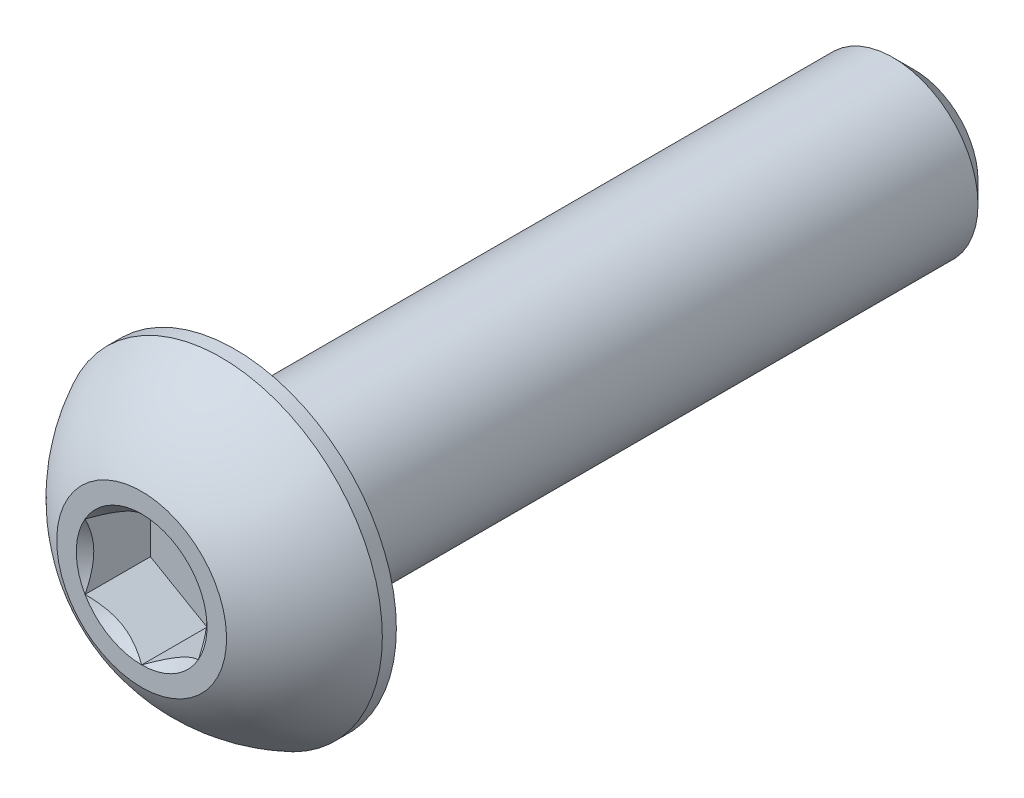
ISO-10303-21;
HEADER;
FILE_DESCRIPTION(('STEP AP214'),'2;1');
FILE_NAME('part.step','',(''),(''),'','','');
FILE_SCHEMA(('AUTOMOTIVE_DESIGN { 1 0 10303 214 1 1 1 1 }'));
ENDSEC;
DATA;
#1=APPLICATION_CONTEXT('core data for automotive mechanical design processes');
#2=APPLICATION_PROTOCOL_DEFINITION('international standard','automotive_design',2000,#1);
#3=PRODUCT_CONTEXT('',#1,'mechanical');
#4=PRODUCT('Part','Part','',(#3));
#5=PRODUCT_RELATED_PRODUCT_CATEGORY('part','',(#4));
#6=PRODUCT_DEFINITION_FORMATION('','',#4);
#7=PRODUCT_DEFINITION_CONTEXT('part definition',#1,'design');
#8=PRODUCT_DEFINITION('design','',#6,#7);
#9=PRODUCT_DEFINITION_SHAPE('','',#8);
#10=(LENGTH_UNIT() NAMED_UNIT(*) SI_UNIT(.MILLI.,.METRE.));
#11=(NAMED_UNIT(*) PLANE_ANGLE_UNIT() SI_UNIT($,.RADIAN.));
#12=(NAMED_UNIT(*) SI_UNIT($,.STERADIAN.) SOLID_ANGLE_UNIT());
#13=UNCERTAINTY_MEASURE_WITH_UNIT(LENGTH_MEASURE(1.E-05),#10,'distance_accuracy_value','');
#14=(GEOMETRIC_REPRESENTATION_CONTEXT(3) GLOBAL_UNCERTAINTY_ASSIGNED_CONTEXT((#13)) GLOBAL_UNIT_ASSIGNED_CONTEXT((#10,
#11,#12)) REPRESENTATION_CONTEXT('',''));
#15=CARTESIAN_POINT('',(0.,0.,0.));
#16=DIRECTION('',(0.,0.,1.));
#17=DIRECTION('',(1.,0.,0.));
#18=AXIS2_PLACEMENT_3D('',#15,#16,#17);
#19=CARTESIAN_POINT('',(0.,0.,-13.65));
#20=DIRECTION('',(0.,0.,1.));
#21=DIRECTION('',(1.,0.,0.));
#22=AXIS2_PLACEMENT_3D('',#19,#20,#21);
#23=PLANE('',#22);
#24=CARTESIAN_POINT('',(0.,0.,-13.65));
#25=DIRECTION('',(0.,0.,1.));
#26=DIRECTION('',(1.,0.,0.));
#27=AXIS2_PLACEMENT_3D('',#24,#25,#26);
#28=CIRCLE('',#27,1.12500000000003);
#29=CARTESIAN_POINT('',(1.12500000000003,0.,-13.65));
#30=VERTEX_POINT('',#29);
#31=EDGE_CURVE('E44',#30,#30,#28,.T.);
#32=ORIENTED_EDGE('',*,*,#31,.F.);
#33=EDGE_LOOP('',(#32));
#34=FACE_BOUND('',#33,.T.);
#35=ADVANCED_FACE('F41',(#34),#23,.F.);
#36=CARTESIAN_POINT('',(0.,0.,-13.65));
#37=DIRECTION('',(0.,0.,1.));
#38=DIRECTION('',(1.,0.,0.));
#39=AXIS2_PLACEMENT_3D('',#36,#37,#38);
#40=CONICAL_SURFACE('',#39,1.12500000000003,0.785398163397431);
#41=CARTESIAN_POINT('',(0.,0.,-13.275));
#42=DIRECTION('',(0.,0.,1.));
#43=DIRECTION('',(1.,0.,0.));
#44=AXIS2_PLACEMENT_3D('',#41,#42,#43);
#45=CIRCLE('',#44,1.50000000000002);
#46=CARTESIAN_POINT('',(1.50000000000002,0.,-13.275));
#47=VERTEX_POINT('',#46);
#48=EDGE_CURVE('E138',#47,#47,#45,.T.);
#49=ORIENTED_EDGE('',*,*,#48,.F.);
#50=EDGE_LOOP('',(#49));
#51=FACE_BOUND('',#50,.T.);
#52=ORIENTED_EDGE('',*,*,#31,.T.);
#53=EDGE_LOOP('',(#52));
#54=FACE_BOUND('',#53,.T.);
#55=ADVANCED_FACE('F161',(#51,#54),#40,.T.);
#56=CARTESIAN_POINT('',(0.,0.,0.));
#57=DIRECTION('',(0.,0.,1.));
#58=DIRECTION('',(1.,0.,0.));
#59=AXIS2_PLACEMENT_3D('',#56,#57,#58);
#60=CYLINDRICAL_SURFACE('',#59,1.50000000000002);
#61=CARTESIAN_POINT('',(0.,0.,-1.65000000000001));
#62=DIRECTION('',(0.,0.,1.));
#63=DIRECTION('',(1.,0.,0.));
#64=AXIS2_PLACEMENT_3D('',#61,#62,#63);
#65=CIRCLE('',#64,1.50000000000002);
#66=CARTESIAN_POINT('',(1.50000000000002,0.,-1.65000000000001));
#67=VERTEX_POINT('',#66);
#68=EDGE_CURVE('E12',#67,#67,#65,.T.);
#69=ORIENTED_EDGE('',*,*,#68,.F.);
#70=EDGE_LOOP('',(#69));
#71=FACE_BOUND('',#70,.T.);
#72=ORIENTED_EDGE('',*,*,#48,.T.);
#73=EDGE_LOOP('',(#72));
#74=FACE_BOUND('',#73,.T.);
#75=ADVANCED_FACE('F168',(#71,#74),#60,.T.);
#76=CARTESIAN_POINT('',(2.85000000000002,0.,-1.65000000000001));
#77=DIRECTION('',(0.,0.,-1.));
#78=DIRECTION('',(-1.,0.,0.));
#79=AXIS2_PLACEMENT_3D('',#76,#77,#78);
#80=PLANE('',#79);
#81=ORIENTED_EDGE('',*,*,#68,.T.);
#82=EDGE_LOOP('',(#81));
#83=FACE_BOUND('',#82,.T.);
#84=CARTESIAN_POINT('',(0.,0.,-1.65000000000001));
#85=DIRECTION('',(0.,0.,1.));
#86=DIRECTION('',(1.,0.,0.));
#87=AXIS2_PLACEMENT_3D('',#84,#85,#86);
#88=CIRCLE('',#87,2.85);
#89=CARTESIAN_POINT('',(2.85,0.,-1.65000000000001));
#90=VERTEX_POINT('',#89);
#91=EDGE_CURVE('E262',#90,#90,#88,.T.);
#92=ORIENTED_EDGE('',*,*,#91,.F.);
#93=EDGE_LOOP('',(#92));
#94=FACE_BOUND('',#93,.T.);
#95=ADVANCED_FACE('F171',(#83,#94),#80,.T.);
#96=CARTESIAN_POINT('',(1.,-0.577350269189592,-1.1550000000001));
#97=DIRECTION('',(0.,0.,1.));
#98=DIRECTION('',(1.,0.,0.));
#99=AXIS2_PLACEMENT_3D('',#96,#97,#98);
#100=PLANE('',#99);
#101=DIRECTION('',(0.866025403784438,0.5,0.));
#102=VECTOR('',#101,1.);
#103=CARTESIAN_POINT('',(0.,-1.15470053837929,-1.15499999999999));
#104=LINE('',#103,#102);
#105=CARTESIAN_POINT('',(0.,-1.15470053837929,-1.15499999999999));
#106=VERTEX_POINT('',#105);
#107=CARTESIAN_POINT('',(1.,-0.577350269189592,-1.1550000000001));
#108=VERTEX_POINT('',#107);
#109=EDGE_CURVE('E112',#106,#108,#104,.T.);
#110=ORIENTED_EDGE('',*,*,#109,.T.);
#111=DIRECTION('',(0.,1.,0.));
#112=VECTOR('',#111,1.);
#113=CARTESIAN_POINT('',(1.,-0.577350269189592,-1.1550000000001));
#114=LINE('',#113,#112);
#115=CARTESIAN_POINT('',(1.,0.577350269189592,-1.1550000000001));
#116=VERTEX_POINT('',#115);
#117=EDGE_CURVE('E299',#108,#116,#114,.T.);
#118=ORIENTED_EDGE('',*,*,#117,.T.);
#119=DIRECTION('',(-0.866025403784439,0.499999999999999,0.));
#120=VECTOR('',#119,1.);
#121=CARTESIAN_POINT('',(1.,0.577350269189592,-1.1550000000001));
#122=LINE('',#121,#120);
#123=CARTESIAN_POINT('',(0.,1.15470053837929,-1.15499999999999));
#124=VERTEX_POINT('',#123);
#125=EDGE_CURVE('E295',#116,#124,#122,.T.);
#126=ORIENTED_EDGE('',*,*,#125,.T.);
#127=DIRECTION('',(-0.866025403784439,-0.5,0.));
#128=VECTOR('',#127,1.);
#129=CARTESIAN_POINT('',(0.,1.15470053837929,-1.15499999999999));
#130=LINE('',#129,#128);
#131=CARTESIAN_POINT('',(-1.,0.577350269189592,-1.15500000000013));
#132=VERTEX_POINT('',#131);
#133=EDGE_CURVE('E291',#124,#132,#130,.T.);
#134=ORIENTED_EDGE('',*,*,#133,.T.);
#135=DIRECTION('',(0.,-1.,0.));
#136=VECTOR('',#135,1.);
#137=CARTESIAN_POINT('',(-1.,0.577350269189592,-1.15500000000013));
#138=LINE('',#137,#136);
#139=CARTESIAN_POINT('',(-1.,-0.577350269189592,-1.15500000000013));
#140=VERTEX_POINT('',#139);
#141=EDGE_CURVE('E287',#132,#140,#138,.T.);
#142=ORIENTED_EDGE('',*,*,#141,.T.);
#143=DIRECTION('',(0.866025403784439,-0.5,0.));
#144=VECTOR('',#143,1.);
#145=CARTESIAN_POINT('',(-1.,-0.577350269189592,-1.15500000000013));
#146=LINE('',#145,#144);
#147=EDGE_CURVE('E271',#140,#106,#146,.T.);
#148=ORIENTED_EDGE('',*,*,#147,.T.);
#149=EDGE_LOOP('',(#110,#118,#126,#134,#142,#148));
#150=FACE_BOUND('',#149,.T.);
#151=ADVANCED_FACE('F164',(#150),#100,.T.);
#152=CARTESIAN_POINT('',(-1.,-0.577350269189592,-1.15500000000013));
#153=DIRECTION('',(-0.5,-0.866025403784439,0.));
#154=DIRECTION('',(0.866025403784439,-0.5,0.));
#155=AXIS2_PLACEMENT_3D('',#152,#153,#154);
#156=PLANE('',#155);
#157=DIRECTION('',(0.,0.,1.));
#158=VECTOR('',#157,1.);
#159=CARTESIAN_POINT('',(-1.,-0.577350269189592,-1.15500000000013));
#160=LINE('',#159,#158);
#161=CARTESIAN_POINT('',(-1.,-0.577350269189592,-1.11022302462516E-13));
#162=VERTEX_POINT('',#161);
#163=EDGE_CURVE('E119',#140,#162,#160,.T.);
#164=ORIENTED_EDGE('',*,*,#163,.T.);
#165=CARTESIAN_POINT('',(-1.00020000000001,-0.57723479913574,0.000115487372498446));
#166=CARTESIAN_POINT('',(-0.965817404992807,-0.597085599618594,-0.0197220691743291));
#167=CARTESIAN_POINT('',(-0.930859881860152,-0.617268335009436,-0.0383949793611503));
#168=CARTESIAN_POINT('',(-0.859577197043879,-0.65842341227667,-0.0725852572768633));
#169=CARTESIAN_POINT('',(-0.823245249470986,-0.679399671988061,-0.0880835909765679));
#170=CARTESIAN_POINT('',(-0.749983386196663,-0.72169742847083,-0.114632692857768));
#171=CARTESIAN_POINT('',(-0.713072148554564,-0.743008141459626,-0.12575022600311));
#172=CARTESIAN_POINT('',(-0.638437270689108,-0.786098608286161,-0.142880134223841));
#173=CARTESIAN_POINT('',(-0.600715911891317,-0.807877044942236,-0.148905302533336));
#174=CARTESIAN_POINT('',(-0.535707801582028,-0.845409494928823,-0.154339445032517));
#175=CARTESIAN_POINT('',(-0.508505628471805,-0.861114676896574,-0.155143061683289));
#176=CARTESIAN_POINT('',(-0.454153959330884,-0.892494627706005,-0.153793300583146));
#177=CARTESIAN_POINT('',(-0.427004476245124,-0.908169389073921,-0.151639270452835));
#178=CARTESIAN_POINT('',(-0.345943722673061,-0.954969836969461,-0.140883027871549));
#179=CARTESIAN_POINT('',(-0.292435859021621,-0.985862616452396,-0.127985443584627));
#180=CARTESIAN_POINT('',(-0.198523934856619,-1.04008269114918,-0.0968592693978172));
#181=CARTESIAN_POINT('',(-0.157679476328197,-1.06366425027546,-0.0802622022981839));
#182=CARTESIAN_POINT('',(-0.0775903626180563,-1.10990372163515,-0.0428750753147612));
#183=CARTESIAN_POINT('',(-0.0383409891295505,-1.13256435798426,-0.0220986581826527));
#184=CARTESIAN_POINT('',(0.000200000000005751,-1.15481600843304,0.000115487372609469));
#185=B_SPLINE_CURVE_WITH_KNOTS('',3,(#165,#166,#167,#168,#169,#170,#171,#172,#173,#174,#175,
#176,#177,#178,#179,#180,#181,#182,#183,#184),.UNSPECIFIED.,.F.,.F.,(4,2,2,2,2,2,2,2,2,4),(0.,
0.133237676828565,0.267252229834496,0.399137076269304,0.530689603280776,0.624814864263833,
0.718960890149095,0.907306626112015,1.05710100361784,1.20641411519283),.UNSPECIFIED.);
#186=CARTESIAN_POINT('',(0.,-1.15470053837929,0.));
#187=VERTEX_POINT('',#186);
#188=EDGE_CURVE('E101',#162,#187,#185,.T.);
#189=ORIENTED_EDGE('',*,*,#188,.T.);
#190=DIRECTION('',(0.,0.,1.));
#191=VECTOR('',#190,1.);
#192=CARTESIAN_POINT('',(0.,-1.15470053837929,-1.15499999999999));
#193=LINE('',#192,#191);
#194=EDGE_CURVE('E118',#106,#187,#193,.T.);
#195=ORIENTED_EDGE('',*,*,#194,.F.);
#196=ORIENTED_EDGE('',*,*,#147,.F.);
#197=EDGE_LOOP('',(#164,#189,#195,#196));
#198=FACE_BOUND('',#197,.T.);
#199=ADVANCED_FACE('F116',(#198),#156,.F.);
#200=CARTESIAN_POINT('',(0.,-1.15470053837929,-1.15499999999999));
#201=DIRECTION('',(0.500000000000001,-0.866025403784438,0.));
#202=DIRECTION('',(0.866025403784438,0.500000000000001,0.));
#203=AXIS2_PLACEMENT_3D('',#200,#201,#202);
#204=PLANE('',#203);
#205=ORIENTED_EDGE('',*,*,#194,.T.);
#206=CARTESIAN_POINT('',(-0.000200000000005751,-1.15481600843304,0.000115487372609469));
#207=CARTESIAN_POINT('',(0.0341825950072014,-1.13496520795025,-0.0197220691742508));
#208=CARTESIAN_POINT('',(0.069140118139854,-1.11478247255944,-0.0383949793610854));
#209=CARTESIAN_POINT('',(0.140422802956123,-1.07362739529223,-0.0725852572768083));
#210=CARTESIAN_POINT('',(0.176754750529013,-1.05265113558083,-0.0880835909765086));
#211=CARTESIAN_POINT('',(0.250016613803337,-1.01035337909805,-0.114632692857699));
#212=CARTESIAN_POINT('',(0.286927851445441,-0.989042666109256,-0.125750226003034));
#213=CARTESIAN_POINT('',(0.361562729310899,-0.945952199282722,-0.142880134223788));
#214=CARTESIAN_POINT('',(0.399284088108686,-0.92417376262665,-0.148905302533313));
#215=CARTESIAN_POINT('',(0.464292198417972,-0.886641312640062,-0.154339445032486));
#216=CARTESIAN_POINT('',(0.491494371528196,-0.870936130672309,-0.155143061683237));
#217=CARTESIAN_POINT('',(0.545846040669121,-0.83955617986288,-0.153793300583066));
#218=CARTESIAN_POINT('',(0.572995523754886,-0.823881418494969,-0.151639270452749));
#219=CARTESIAN_POINT('',(0.654056277326951,-0.777080970599395,-0.140883027871522));
#220=CARTESIAN_POINT('',(0.707564140978383,-0.74618819111637,-0.127985443584748));
#221=CARTESIAN_POINT('',(0.801476065143376,-0.691968116419604,-0.0968592693979216));
#222=CARTESIAN_POINT('',(0.842320523671795,-0.668386557293394,-0.080262202298183));
#223=CARTESIAN_POINT('',(0.922409637381937,-0.622147085933769,-0.0428750753146517));
#224=CARTESIAN_POINT('',(0.961659010870446,-0.599486449584661,-0.0220986581825393));
#225=CARTESIAN_POINT('',(1.00020000000001,-0.57723479913574,0.000115487372526202));
#226=B_SPLINE_CURVE_WITH_KNOTS('',3,(#206,#207,#208,#209,#210,#211,#212,#213,#214,#215,#216,
#217,#218,#219,#220,#221,#222,#223,#224,#225),.UNSPECIFIED.,.F.,.F.,(4,2,2,2,2,2,2,2,2,4),(0.,
0.133237676828535,0.26725222983446,0.399137076269282,0.53068960328075,0.624814864263807,
0.718960890149083,0.907306626112007,1.05710100361782,1.20641411519282),.UNSPECIFIED.);
#227=CARTESIAN_POINT('',(1.,-0.577350269189592,-1.11022302462516E-13));
#228=VERTEX_POINT('',#227);
#229=EDGE_CURVE('E108',#187,#228,#226,.T.);
#230=ORIENTED_EDGE('',*,*,#229,.T.);
#231=DIRECTION('',(0.,0.,1.));
#232=VECTOR('',#231,1.);
#233=CARTESIAN_POINT('',(1.,-0.577350269189592,-1.1550000000001));
#234=LINE('',#233,#232);
#235=EDGE_CURVE('E64',#108,#228,#234,.T.);
#236=ORIENTED_EDGE('',*,*,#235,.F.);
#237=ORIENTED_EDGE('',*,*,#109,.F.);
#238=EDGE_LOOP('',(#205,#230,#236,#237));
#239=FACE_BOUND('',#238,.T.);
#240=ADVANCED_FACE('F123',(#239),#204,.F.);
#241=CARTESIAN_POINT('',(1.,-0.577350269189592,-1.1550000000001));
#242=DIRECTION('',(1.,0.,0.));
#243=DIRECTION('',(0.,1.,0.));
#244=AXIS2_PLACEMENT_3D('',#241,#242,#243);
#245=PLANE('',#244);
#246=ORIENTED_EDGE('',*,*,#235,.T.);
#247=CARTESIAN_POINT('',(1.,-1.1514720864646,0.370385677513768));
#248=CARTESIAN_POINT('',(1.,-1.12343447988548,0.349219919873656));
#249=CARTESIAN_POINT('',(1.,-1.09524064850693,0.328261692175873));
#250=CARTESIAN_POINT('',(1.,-1.03847715644372,0.286846022235605));
#251=CARTESIAN_POINT('',(1.,-1.00990740382972,0.266388706123643));
#252=CARTESIAN_POINT('',(1.,-0.923120894333453,0.205604794954487));
#253=CARTESIAN_POINT('',(1.,-0.864253173759034,0.166192228961369));
#254=CARTESIAN_POINT('',(1.,-0.740809858258006,0.0888206642001995));
#255=CARTESIAN_POINT('',(1.,-0.676100255137754,0.0510730391143684));
#256=CARTESIAN_POINT('',(1.,-0.543448939049115,-0.0179754124487613));
#257=CARTESIAN_POINT('',(1.,-0.475519112027825,-0.0492979721532992));
#258=CARTESIAN_POINT('',(1.,-0.373555850333564,-0.0876182211162822));
#259=CARTESIAN_POINT('',(1.,-0.341031989670926,-0.0986164083578572));
#260=CARTESIAN_POINT('',(1.,-0.275199079052298,-0.118001657852613));
#261=CARTESIAN_POINT('',(1.,-0.241889975173943,-0.126388540223298));
#262=CARTESIAN_POINT('',(1.,-0.175247517043006,-0.139974779280976));
#263=CARTESIAN_POINT('',(1.,-0.141925568218187,-0.145229209231999));
#264=CARTESIAN_POINT('',(1.,-0.0749144362322959,-0.152451313429132));
#265=CARTESIAN_POINT('',(1.,-0.0412251978501849,-0.154418486389602));
#266=CARTESIAN_POINT('',(1.,0.0249580992633844,-0.154916801606947));
#267=CARTESIAN_POINT('',(1.,0.0574512826459954,-0.153569732111393));
#268=CARTESIAN_POINT('',(1.,0.122148505701814,-0.14778351550099));
#269=CARTESIAN_POINT('',(1.,0.154352610132871,-0.143345079338466));
#270=CARTESIAN_POINT('',(1.,0.218799898867578,-0.13154316985481));
#271=CARTESIAN_POINT('',(1.,0.251033743268887,-0.12412945896149));
#272=CARTESIAN_POINT('',(1.,0.314797132354855,-0.106771057501354));
#273=CARTESIAN_POINT('',(1.,0.346326735730949,-0.0968265787112462));
#274=CARTESIAN_POINT('',(1.,0.44559418773016,-0.0617765174458042));
#275=CARTESIAN_POINT('',(1.,0.511919139475962,-0.0326791416433408));
#276=CARTESIAN_POINT('',(1.,0.641453244657445,0.0320153296864961));
#277=CARTESIAN_POINT('',(1.,0.704650133126273,0.0676357767152145));
#278=CARTESIAN_POINT('',(1.,0.825428490174939,0.141123901346897));
#279=CARTESIAN_POINT('',(1.,0.883132947867645,0.178791947135431));
#280=CARTESIAN_POINT('',(1.,0.968148853704525,0.237022852943142));
#281=CARTESIAN_POINT('',(1.,0.99612057038024,0.256638475762837));
#282=CARTESIAN_POINT('',(1.,1.05168177729897,0.296388517061235));
#283=CARTESIAN_POINT('',(1.,1.07927136997697,0.316522792198778));
#284=CARTESIAN_POINT('',(1.,1.10670185346329,0.336872119072879));
#285=B_SPLINE_CURVE_WITH_KNOTS('',3,(#247,#248,#249,#250,#251,#252,#253,#254,#255,#256,#257,
#258,#259,#260,#261,#262,#263,#264,#265,#266,#267,#268,#269,#270,#271,#272,#273,#274,#275,#276,
#277,#278,#279,#280,#281,#282,#283,#284),.UNSPECIFIED.,.F.,.F.,(4,2,2,2,2,2,2,2,2,2,2,2,2,2,2,2,
2,2,4),(0.,0.105386459083268,0.210799187330084,0.423233611565438,0.647793540908474,
0.871580877738546,0.974493074181347,1.07741235827194,1.17846428203197,1.27953161415754,
1.37694086739601,1.47432772585397,1.57343322804282,1.67253043972838,1.88917353996814,
2.10660791038802,2.31323734249835,2.41572589232035,2.51818641476493),.UNSPECIFIED.);
#286=CARTESIAN_POINT('',(1.,0.577350269189592,-1.11022302462516E-13));
#287=VERTEX_POINT('',#286);
#288=EDGE_CURVE('E191',#228,#287,#285,.T.);
#289=ORIENTED_EDGE('',*,*,#288,.T.);
#290=DIRECTION('',(0.,0.,1.));
#291=VECTOR('',#290,1.);
#292=CARTESIAN_POINT('',(1.,0.577350269189592,-1.1550000000001));
#293=LINE('',#292,#291);
#294=EDGE_CURVE('E272',#116,#287,#293,.T.);
#295=ORIENTED_EDGE('',*,*,#294,.F.);
#296=ORIENTED_EDGE('',*,*,#117,.F.);
#297=EDGE_LOOP('',(#246,#289,#295,#296));
#298=FACE_BOUND('',#297,.T.);
#299=ADVANCED_FACE('F236',(#298),#245,.F.);
#300=CARTESIAN_POINT('',(1.,0.577350269189592,-1.1550000000001));
#301=DIRECTION('',(0.499999999999999,0.866025403784439,0.));
#302=DIRECTION('',(-0.866025403784439,0.499999999999999,0.));
#303=AXIS2_PLACEMENT_3D('',#300,#301,#302);
#304=PLANE('',#303);
#305=ORIENTED_EDGE('',*,*,#294,.T.);
#306=CARTESIAN_POINT('',(1.00020000000001,0.57723479913574,0.000115487372526202));
#307=CARTESIAN_POINT('',(0.965817404992812,0.597085599618591,-0.019722069174319));
#308=CARTESIAN_POINT('',(0.930859881860159,0.617268335009432,-0.0383949793611457));
#309=CARTESIAN_POINT('',(0.859577197043887,0.658423412276665,-0.0725852572768608));
#310=CARTESIAN_POINT('',(0.823245249470995,0.679399671988055,-0.0880835909765621));
#311=CARTESIAN_POINT('',(0.749983386196674,0.721697428470824,-0.114632692857767));
#312=CARTESIAN_POINT('',(0.713072148554574,0.74300814145962,-0.125750226003116));
#313=CARTESIAN_POINT('',(0.638437270689114,0.786098608286157,-0.142880134223832));
#314=CARTESIAN_POINT('',(0.600715911891319,0.807877044942235,-0.148905302533303));
#315=CARTESIAN_POINT('',(0.535707801582027,0.845409494928823,-0.154339445032493));
#316=CARTESIAN_POINT('',(0.508505628471804,0.861114676896574,-0.155143061683283));
#317=CARTESIAN_POINT('',(0.454153959330883,0.892494627706005,-0.153793300583153));
#318=CARTESIAN_POINT('',(0.427004476245123,0.908169389073922,-0.151639270452838));
#319=CARTESIAN_POINT('',(0.34594372267306,0.954969836969462,-0.140883027871544));
#320=CARTESIAN_POINT('',(0.292435859021621,0.985862616452396,-0.127985443584626));
#321=CARTESIAN_POINT('',(0.198523934856619,1.04008269114918,-0.0968592693978183));
#322=CARTESIAN_POINT('',(0.157679476328197,1.06366425027546,-0.080262202298185));
#323=CARTESIAN_POINT('',(0.0775903626180565,1.10990372163515,-0.0428750753147615));
#324=CARTESIAN_POINT('',(0.0383409891295504,1.13256435798426,-0.0220986581826523));
#325=CARTESIAN_POINT('',(-0.000200000000005751,1.15481600843304,0.000115487372609469));
#326=B_SPLINE_CURVE_WITH_KNOTS('',3,(#306,#307,#308,#309,#310,#311,#312,#313,#314,#315,#316,
#317,#318,#319,#320,#321,#322,#323,#324,#325),.UNSPECIFIED.,.F.,.F.,(4,2,2,2,2,2,2,2,2,4),(0.,
0.133237676828569,0.267252229834494,0.399137076269305,0.530689603280784,0.624814864263843,
0.718960890149105,0.907306626112023,1.05710100361785,1.20641411519284),.UNSPECIFIED.);
#327=CARTESIAN_POINT('',(0.,1.15470053837929,0.));
#328=VERTEX_POINT('',#327);
#329=EDGE_CURVE('E143',#287,#328,#326,.T.);
#330=ORIENTED_EDGE('',*,*,#329,.T.);
#331=DIRECTION('',(0.,0.,1.));
#332=VECTOR('',#331,1.);
#333=CARTESIAN_POINT('',(0.,1.15470053837929,-1.15499999999999));
#334=LINE('',#333,#332);
#335=EDGE_CURVE('E276',#124,#328,#334,.T.);
#336=ORIENTED_EDGE('',*,*,#335,.F.);
#337=ORIENTED_EDGE('',*,*,#125,.F.);
#338=EDGE_LOOP('',(#305,#330,#336,#337));
#339=FACE_BOUND('',#338,.T.);
#340=ADVANCED_FACE('F232',(#339),#304,.F.);
#341=CARTESIAN_POINT('',(0.,1.15470053837929,-1.15499999999999));
#342=DIRECTION('',(-0.5,0.866025403784439,0.));
#343=DIRECTION('',(-0.866025403784439,-0.5,0.));
#344=AXIS2_PLACEMENT_3D('',#341,#342,#343);
#345=PLANE('',#344);
#346=ORIENTED_EDGE('',*,*,#335,.T.);
#347=CARTESIAN_POINT('',(0.000200000000005751,1.15481600843304,0.000115487372609469));
#348=CARTESIAN_POINT('',(-0.0341825950071968,1.13496520795026,-0.0197220691742432));
#349=CARTESIAN_POINT('',(-0.0691401181398401,1.11478247255945,-0.0383949793610755));
#350=CARTESIAN_POINT('',(-0.140422802956093,1.07362739529224,-0.072585257276797));
#351=CARTESIAN_POINT('',(-0.176754750528977,1.05265113558084,-0.088083590976498));
#352=CARTESIAN_POINT('',(-0.250016613803295,1.01035337909808,-0.114632692857681));
#353=CARTESIAN_POINT('',(-0.286927851445401,0.989042666109299,-0.125750226003009));
#354=CARTESIAN_POINT('',(-0.361562729310825,0.945952199282745,-0.142880134223787));
#355=CARTESIAN_POINT('',(-0.399284088108578,0.924173762626637,-0.148905302533343));
#356=CARTESIAN_POINT('',(-0.46429219841787,0.886641312640065,-0.154339445032513));
#357=CARTESIAN_POINT('',(-0.491494371528118,0.870936130672339,-0.155143061683245));
#358=CARTESIAN_POINT('',(-0.54584604066907,0.839556179862926,-0.153793300583061));
#359=CARTESIAN_POINT('',(-0.572995523754837,0.823881418495003,-0.151639270452748));
#360=CARTESIAN_POINT('',(-0.654056277326917,0.777080970599405,-0.14088302787154));
#361=CARTESIAN_POINT('',(-0.707564140978371,0.746188191116377,-0.127985443584781));
#362=CARTESIAN_POINT('',(-0.801476065143368,0.691968116419608,-0.0968592693979505));
#363=CARTESIAN_POINT('',(-0.842320523671772,0.668386557293398,-0.0802622022982016));
#364=CARTESIAN_POINT('',(-0.922409637381903,0.622147085933799,-0.0428750753146596));
#365=CARTESIAN_POINT('',(-0.961659010870417,0.599486449584716,-0.0220986581825467));
#366=CARTESIAN_POINT('',(-1.00020000000001,0.577234799135851,0.000115487372498446));
#367=B_SPLINE_CURVE_WITH_KNOTS('',3,(#347,#348,#349,#350,#351,#352,#353,#354,#355,#356,#357,
#358,#359,#360,#361,#362,#363,#364,#365,#366),.UNSPECIFIED.,.F.,.F.,(4,2,2,2,2,2,2,2,2,4),(0.,
0.133237676828506,0.267252229834414,0.399137076269216,0.530689603280658,0.624814864263735,
0.718960890149035,0.907306626112005,1.05710100361779,1.20641411519276),.UNSPECIFIED.);
#368=CARTESIAN_POINT('',(-1.,0.577350269189592,-1.11022302462516E-13));
#369=VERTEX_POINT('',#368);
#370=EDGE_CURVE('E201',#328,#369,#367,.T.);
#371=ORIENTED_EDGE('',*,*,#370,.T.);
#372=DIRECTION('',(0.,0.,1.));
#373=VECTOR('',#372,1.);
#374=CARTESIAN_POINT('',(-1.,0.577350269189592,-1.15500000000013));
#375=LINE('',#374,#373);
#376=EDGE_CURVE('E280',#132,#369,#375,.T.);
#377=ORIENTED_EDGE('',*,*,#376,.F.);
#378=ORIENTED_EDGE('',*,*,#133,.F.);
#379=EDGE_LOOP('',(#346,#371,#377,#378));
#380=FACE_BOUND('',#379,.T.);
#381=ADVANCED_FACE('F228',(#380),#345,.F.);
#382=CARTESIAN_POINT('',(-1.,0.577350269189592,-1.15500000000013));
#383=DIRECTION('',(-1.,0.,0.));
#384=DIRECTION('',(0.,-1.,0.));
#385=AXIS2_PLACEMENT_3D('',#382,#383,#384);
#386=PLANE('',#385);
#387=ORIENTED_EDGE('',*,*,#376,.T.);
#388=CARTESIAN_POINT('',(-1.,-1.1514720864646,0.37038567751374));
#389=CARTESIAN_POINT('',(-1.,-1.12343447988547,0.349219919873639));
#390=CARTESIAN_POINT('',(-1.,-1.09524064850692,0.32826169217586));
#391=CARTESIAN_POINT('',(-1.,-1.0384771564437,0.286846022235594));
#392=CARTESIAN_POINT('',(-1.,-1.0099074038297,0.26638870612363));
#393=CARTESIAN_POINT('',(-1.,-0.923120894333429,0.205604794954468));
#394=CARTESIAN_POINT('',(-1.,-0.864253173759005,0.166192228961346));
#395=CARTESIAN_POINT('',(-1.,-0.740809858257972,0.0888206642001826));
#396=CARTESIAN_POINT('',(-1.,-0.676100255137721,0.0510730391143613));
#397=CARTESIAN_POINT('',(-1.,-0.543448939049097,-0.0179754124487811));
#398=CARTESIAN_POINT('',(-1.,-0.475519112027823,-0.0492979721533416));
#399=CARTESIAN_POINT('',(-1.,-0.373555850333564,-0.0876182211163035));
#400=CARTESIAN_POINT('',(-1.,-0.341031989670922,-0.0986164083578642));
#401=CARTESIAN_POINT('',(-1.,-0.275199079052295,-0.118001657852609));
#402=CARTESIAN_POINT('',(-1.,-0.241889975173941,-0.126388540223297));
#403=CARTESIAN_POINT('',(-1.,-0.175247517043007,-0.139974779280978));
#404=CARTESIAN_POINT('',(-1.,-0.141925568218188,-0.145229209231999));
#405=CARTESIAN_POINT('',(-1.,-0.0749144362322964,-0.152451313429132));
#406=CARTESIAN_POINT('',(-1.,-0.0412251978501851,-0.154418486389602));
#407=CARTESIAN_POINT('',(-1.,0.0249580992633935,-0.154916801606947));
#408=CARTESIAN_POINT('',(-1.,0.0574512826460136,-0.153569732111392));
#409=CARTESIAN_POINT('',(-1.,0.12214850570185,-0.147783515500987));
#410=CARTESIAN_POINT('',(-1.,0.154352610132917,-0.143345079338463));
#411=CARTESIAN_POINT('',(-1.,0.218799898867637,-0.131543169854795));
#412=CARTESIAN_POINT('',(-1.,0.25103374326895,-0.124129458961462));
#413=CARTESIAN_POINT('',(-1.,0.31479713235494,-0.106771057501343));
#414=CARTESIAN_POINT('',(-1.,0.34632673573105,-0.0968265787112645));
#415=CARTESIAN_POINT('',(-1.,0.445594187730263,-0.0617765174458633));
#416=CARTESIAN_POINT('',(-1.,0.511919139476024,-0.0326791416433398));
#417=CARTESIAN_POINT('',(-1.,0.641453244657461,0.0320153296865338));
#418=CARTESIAN_POINT('',(-1.,0.704650133126285,0.067635776715229));
#419=CARTESIAN_POINT('',(-1.,0.825428490174944,0.141123901346893));
#420=CARTESIAN_POINT('',(-1.,0.883132947867649,0.178791947135431));
#421=CARTESIAN_POINT('',(-1.,0.968148853704525,0.237022852943144));
#422=CARTESIAN_POINT('',(-1.,0.996120570380237,0.256638475762838));
#423=CARTESIAN_POINT('',(-1.,1.05168177729897,0.296388517061228));
#424=CARTESIAN_POINT('',(-1.,1.07927136997697,0.316522792198763));
#425=CARTESIAN_POINT('',(-1.,1.10670185346329,0.336872119072851));
#426=B_SPLINE_CURVE_WITH_KNOTS('',3,(#388,#389,#390,#391,#392,#393,#394,#395,#396,#397,#398,
#399,#400,#401,#402,#403,#404,#405,#406,#407,#408,#409,#410,#411,#412,#413,#414,#415,#416,#417,
#418,#419,#420,#421,#422,#423,#424,#425),.UNSPECIFIED.,.F.,.F.,(4,2,2,2,2,2,2,2,2,2,2,2,2,2,2,2,
2,2,4),(0.,0.105386459083272,0.210799187330092,0.423233611565463,0.647793540908487,
0.871580877738541,0.974493074181337,1.07741235827193,1.17846428203196,1.27953161415753,
1.37694086739602,1.47432772585401,1.57343322804288,1.67253043972847,1.88917353996817,
2.10660791038802,2.31323734249834,2.41572589232034,2.51818641476491),.UNSPECIFIED.);
#427=EDGE_CURVE('E121',#369,#162,#426,.F.);
#428=ORIENTED_EDGE('',*,*,#427,.T.);
#429=ORIENTED_EDGE('',*,*,#163,.F.);
#430=ORIENTED_EDGE('',*,*,#141,.F.);
#431=EDGE_LOOP('',(#387,#428,#429,#430));
#432=FACE_BOUND('',#431,.T.);
#433=ADVANCED_FACE('F225',(#432),#386,.F.);
#434=CARTESIAN_POINT('',(0.,0.,0.));
#435=DIRECTION('',(0.,0.,1.));
#436=DIRECTION('',(1.,0.,0.));
#437=AXIS2_PLACEMENT_3D('',#434,#435,#436);
#438=CONICAL_SURFACE('',#437,1.15470053837925,0.78539816339745);
#439=CARTESIAN_POINT('',(0.,0.,0.));
#440=DIRECTION('',(0.,0.,1.));
#441=DIRECTION('',(1.,0.,0.));
#442=AXIS2_PLACEMENT_3D('',#439,#440,#441);
#443=CIRCLE('',#442,1.15470053837925);
#444=EDGE_CURVE('E98',#162,#187,#443,.T.);
#445=ORIENTED_EDGE('',*,*,#444,.T.);
#446=ORIENTED_EDGE('',*,*,#188,.F.);
#447=EDGE_LOOP('',(#445,#446));
#448=FACE_BOUND('',#447,.T.);
#449=ADVANCED_FACE('F99',(#448),#438,.F.);
#450=EDGE_CURVE('E56',#187,#228,#443,.T.);
#451=ORIENTED_EDGE('',*,*,#450,.T.);
#452=ORIENTED_EDGE('',*,*,#229,.F.);
#453=EDGE_LOOP('',(#451,#452));
#454=FACE_BOUND('',#453,.T.);
#455=ADVANCED_FACE('F109',(#454),#438,.F.);
#456=EDGE_CURVE('E134',#228,#287,#443,.T.);
#457=ORIENTED_EDGE('',*,*,#456,.T.);
#458=ORIENTED_EDGE('',*,*,#288,.F.);
#459=EDGE_LOOP('',(#457,#458));
#460=FACE_BOUND('',#459,.T.);
#461=ADVANCED_FACE('F186',(#460),#438,.F.);
#462=EDGE_CURVE('E139',#287,#328,#443,.T.);
#463=ORIENTED_EDGE('',*,*,#462,.T.);
#464=ORIENTED_EDGE('',*,*,#329,.F.);
#465=EDGE_LOOP('',(#463,#464));
#466=FACE_BOUND('',#465,.T.);
#467=ADVANCED_FACE('F331',(#466),#438,.F.);
#468=EDGE_CURVE('E142',#328,#369,#443,.T.);
#469=ORIENTED_EDGE('',*,*,#468,.T.);
#470=ORIENTED_EDGE('',*,*,#370,.F.);
#471=EDGE_LOOP('',(#469,#470));
#472=FACE_BOUND('',#471,.T.);
#473=ADVANCED_FACE('F327',(#472),#438,.F.);
#474=EDGE_CURVE('E106',#369,#162,#443,.T.);
#475=ORIENTED_EDGE('',*,*,#474,.T.);
#476=ORIENTED_EDGE('',*,*,#427,.F.);
#477=EDGE_LOOP('',(#475,#476));
#478=FACE_BOUND('',#477,.T.);
#479=ADVANCED_FACE('F250',(#478),#438,.F.);
#480=CARTESIAN_POINT('',(0.,-1.50000000000006,0.));
#481=DIRECTION('',(0.,0.,-1.));
#482=DIRECTION('',(-1.,0.,0.));
#483=AXIS2_PLACEMENT_3D('',#480,#481,#482);
#484=PLANE('',#483);
#485=ORIENTED_EDGE('',*,*,#474,.F.);
#486=ORIENTED_EDGE('',*,*,#468,.F.);
#487=ORIENTED_EDGE('',*,*,#462,.F.);
#488=ORIENTED_EDGE('',*,*,#456,.F.);
#489=ORIENTED_EDGE('',*,*,#450,.F.);
#490=ORIENTED_EDGE('',*,*,#444,.F.);
#491=EDGE_LOOP('',(#485,#486,#487,#488,#489,#490));
#492=FACE_BOUND('',#491,.T.);
#493=CARTESIAN_POINT('',(0.,0.,0.));
#494=DIRECTION('',(0.,0.,1.));
#495=DIRECTION('',(1.,0.,0.));
#496=AXIS2_PLACEMENT_3D('',#493,#494,#495);
#497=CIRCLE('',#496,1.50000000000002);
#498=CARTESIAN_POINT('',(0.,-1.50000000000005,0.));
#499=VERTEX_POINT('',#498);
#500=EDGE_CURVE('E258',#499,#499,#497,.T.);
#501=ORIENTED_EDGE('',*,*,#500,.T.);
#502=EDGE_LOOP('',(#501));
#503=FACE_BOUND('',#502,.T.);
#504=ADVANCED_FACE('F130',(#492,#503),#484,.F.);
#505=CARTESIAN_POINT('',(0.,0.,-2.79483288770052));
#506=DIRECTION('',(0.,0.,1.));
#507=DIRECTION('',(0.,-1.,0.));
#508=AXIS2_PLACEMENT_3D('',#505,#506,#507);
#509=SPHERICAL_SURFACE('',#508,3.17192226735975);
#510=CARTESIAN_POINT('',(0.,0.,-1.4025));
#511=DIRECTION('',(0.,0.,1.));
#512=DIRECTION('',(1.,0.,0.));
#513=AXIS2_PLACEMENT_3D('',#510,#511,#512);
#514=CIRCLE('',#513,2.85);
#515=CARTESIAN_POINT('',(0.,-2.85000000000002,-1.4025));
#516=VERTEX_POINT('',#515);
#517=EDGE_CURVE('E127',#516,#516,#514,.T.);
#518=CARTESIAN_POINT('',(0.,-1.50000000000005,0.));
#519=CARTESIAN_POINT('',(0.,-1.51816007989215,-0.00974656947336525));
#520=CARTESIAN_POINT('',(0.,-1.53622513742986,-0.0196701847238477));
#521=CARTESIAN_POINT('',(0.,-1.57215840256599,-0.0398676311293126));
#522=CARTESIAN_POINT('',(0.,-1.59002661016443,-0.0501414622842949));
#523=CARTESIAN_POINT('',(0.,-1.62555937019155,-0.0710354648490246));
#524=CARTESIAN_POINT('',(0.,-1.64322392262024,-0.0816556362587721));
#525=CARTESIAN_POINT('',(0.,-1.67834266450267,-0.103238276426968));
#526=CARTESIAN_POINT('',(0.,-1.6957968539564,-0.114200745185417));
#527=CARTESIAN_POINT('',(0.,-1.73048823664558,-0.136463816635607));
#528=CARTESIAN_POINT('',(0.,-1.74772542988103,-0.147764419327348));
#529=CARTESIAN_POINT('',(0.,-1.78197627078181,-0.170699464187155));
#530=CARTESIAN_POINT('',(0.,-1.79898991844713,-0.182333906355221));
#531=CARTESIAN_POINT('',(0.,-1.83278720341139,-0.205932209546915));
#532=CARTESIAN_POINT('',(0.,-1.84957084071033,-0.217896070570542));
#533=CARTESIAN_POINT('',(0.,-1.8829017276464,-0.242148665498757));
#534=CARTESIAN_POINT('',(0.,-1.89944897728355,-0.254437399403343));
#535=CARTESIAN_POINT('',(0.,-1.93230080139373,-0.279335070725426));
#536=CARTESIAN_POINT('',(0.,-1.94860537586677,-0.291944008142922));
#537=CARTESIAN_POINT('',(0.,-1.98096565436369,-0.317477295441114));
#538=CARTESIAN_POINT('',(0.,-1.99702135838757,-0.33040164532181));
#539=CARTESIAN_POINT('',(0.,-2.028877795263,-0.356560846652228));
#540=CARTESIAN_POINT('',(0.,-2.04467852811456,-0.369795698101951));
#541=CARTESIAN_POINT('',(0.,-2.07601901880468,-0.39657087369331));
#542=CARTESIAN_POINT('',(0.,-2.09155877664325,-0.410111197834946));
#543=CARTESIAN_POINT('',(0.,-2.12237141262989,-0.437492173862109));
#544=CARTESIAN_POINT('',(0.,-2.13764429077795,-0.451332825747636));
#545=CARTESIAN_POINT('',(0.,-2.16791736411299,-0.479309198198271));
#546=CARTESIAN_POINT('',(0.,-2.18291755929996,-0.493444918763378));
#547=CARTESIAN_POINT('',(0.,-2.21263956705418,-0.522006057390954));
#548=CARTESIAN_POINT('',(0.,-2.22736137962142,-0.536431475453422));
#549=CARTESIAN_POINT('',(0.,-2.25652102825524,-0.565566527816474));
#550=CARTESIAN_POINT('',(0.,-2.27095886432181,-0.580276162117058));
#551=CARTESIAN_POINT('',(0.,-2.29954507397653,-0.609974057702798));
#552=CARTESIAN_POINT('',(0.,-2.31369344756468,-0.624962318987954));
#553=CARTESIAN_POINT('',(0.,-2.34169535627255,-0.655211773418762));
#554=CARTESIAN_POINT('',(0.,-2.35554889139227,-0.670472966564413));
#555=CARTESIAN_POINT('',(0.,-2.38295585920369,-0.701262485885586));
#556=CARTESIAN_POINT('',(0.,-2.3965092918954,-0.716790812061108));
#557=CARTESIAN_POINT('',(0.,-2.42331090492185,-0.748108697108245));
#558=CARTESIAN_POINT('',(0.,-2.43655908525659,-0.76389825597986));
#559=CARTESIAN_POINT('',(0.,-2.46274515962758,-0.795732606824229));
#560=CARTESIAN_POINT('',(0.,-2.47568305366382,-0.811777398796983));
#561=CARTESIAN_POINT('',(0.,-2.50124363939653,-0.844116119267128));
#562=CARTESIAN_POINT('',(0.,-2.51386633109301,-0.860410047764521));
#563=CARTESIAN_POINT('',(0.,-2.53879171587281,-0.893240850042601));
#564=CARTESIAN_POINT('',(0.,-2.55109440895615,-0.909777723823289));
#565=CARTESIAN_POINT('',(0.,-2.57537512182788,-0.943088133113642));
#566=CARTESIAN_POINT('',(0.,-2.58735314161627,-0.959861668623307));
#567=CARTESIAN_POINT('',(0.,-2.61097995657959,-0.993639027894249));
#568=CARTESIAN_POINT('',(0.,-2.6226287517545,-1.01064285165552));
#569=CARTESIAN_POINT('',(0.,-2.64559269128201,-1.04487432644226));
#570=CARTESIAN_POINT('',(0.,-2.6569078356346,-1.06210197746771));
#571=CARTESIAN_POINT('',(0.,-2.67920017403641,-1.09677456077299));
#572=CARTESIAN_POINT('',(0.,-2.69017736808563,-1.11421949305282));
#573=CARTESIAN_POINT('',(0.,-2.71178963499902,-1.14932001019995));
#574=CARTESIAN_POINT('',(0.,-2.72242470786319,-1.16697559506725));
#575=CARTESIAN_POINT('',(0.,-2.7433486908212,-1.20249070903943));
#576=CARTESIAN_POINT('',(0.,-2.75363760091504,-1.2203502381443));
#577=CARTESIAN_POINT('',(0.,-2.77386535089243,-1.25626645340824));
#578=CARTESIAN_POINT('',(0.,-2.78380419077598,-1.27432313956733));
#579=CARTESIAN_POINT('',(0.,-2.8033280161578,-1.31062681184411));
#580=CARTESIAN_POINT('',(0.,-2.81291300165607,-1.32887379796182));
#581=CARTESIAN_POINT('',(0.,-2.83172550494217,-1.3655511220839));
#582=CARTESIAN_POINT('',(0.,-2.84095302273,-1.38398146008827));
#583=CARTESIAN_POINT('',(0.,-2.85000000000002,-1.4025));
#584=B_SPLINE_CURVE_WITH_KNOTS('',3,(#518,#519,#520,#521,#522,#523,#524,#525,#526,#527,#528,
#529,#530,#531,#532,#533,#534,#535,#536,#537,#538,#539,#540,#541,#542,#543,#544,#545,#546,#547,
#548,#549,#550,#551,#552,#553,#554,#555,#556,#557,#558,#559,#560,#561,#562,#563,#564,#565,#566,
#567,#568,#569,#570,#571,#572,#573,#574,#575,#576,#577,#578,#579,#580,#581,#582,#583),
.UNSPECIFIED.,.F.,.F.,(4,2,2,2,2,2,2,2,2,2,2,2,2,2,2,2,2,2,2,2,2,2,2,2,2,2,2,2,2,2,2,2,4),(0.,
0.0618298941826976,0.123659788365395,0.185489682548093,0.24731957673079,0.309149470913488,
0.370979365096186,0.432809259278883,0.494639153461581,0.556469047644278,0.618298941826975,
0.680128836009673,0.741958730192371,0.803788624375068,0.865618518557766,0.927448412740463,
0.989278306923161,1.05110820110586,1.11293809528856,1.17476798947125,1.23659788365395,
1.29842777783665,1.36025767201935,1.42208756620204,1.48391746038474,1.54574735456744,
1.60757724875014,1.66940714293283,1.73123703711553,1.79306693129823,1.85489682548093,
1.91672671966362,1.97855661384632),.UNSPECIFIED.);
#585=EDGE_CURVE('BSEAM246',#499,#516,#584,.T.);
#586=ORIENTED_EDGE('',*,*,#500,.F.);
#587=ORIENTED_EDGE('',*,*,#517,.T.);
#588=ORIENTED_EDGE('',*,*,#585,.T.);
#589=ORIENTED_EDGE('',*,*,#585,.F.);
#590=EDGE_LOOP('',(#586,#588,#587,#589));
#591=FACE_BOUND('',#590,.T.);
#592=ADVANCED_FACE('F246',(#591),#509,.T.);
#593=CARTESIAN_POINT('',(0.,0.,0.));
#594=DIRECTION('',(0.,0.,1.));
#595=DIRECTION('',(1.,0.,0.));
#596=AXIS2_PLACEMENT_3D('',#593,#594,#595);
#597=CYLINDRICAL_SURFACE('',#596,2.85);
#598=ORIENTED_EDGE('',*,*,#517,.F.);
#599=EDGE_LOOP('',(#598));
#600=FACE_BOUND('',#599,.T.);
#601=ORIENTED_EDGE('',*,*,#91,.T.);
#602=EDGE_LOOP('',(#601));
#603=FACE_BOUND('',#602,.T.);
#604=ADVANCED_FACE('F182',(#600,#603),#597,.T.);
#605=CLOSED_SHELL('',(#35,#55,#75,#95,#151,#199,#240,#299,#340,#381,#433,#449,#455,#461,#467,
#473,#479,#504,#592,#604));
#606=MANIFOLD_SOLID_BREP('B2',#605);
#607=ADVANCED_BREP_SHAPE_REPRESENTATION('',(#18,#606),#14);
#608=SHAPE_DEFINITION_REPRESENTATION(#9,#607);
ENDSEC;
END-ISO-10303-21;
